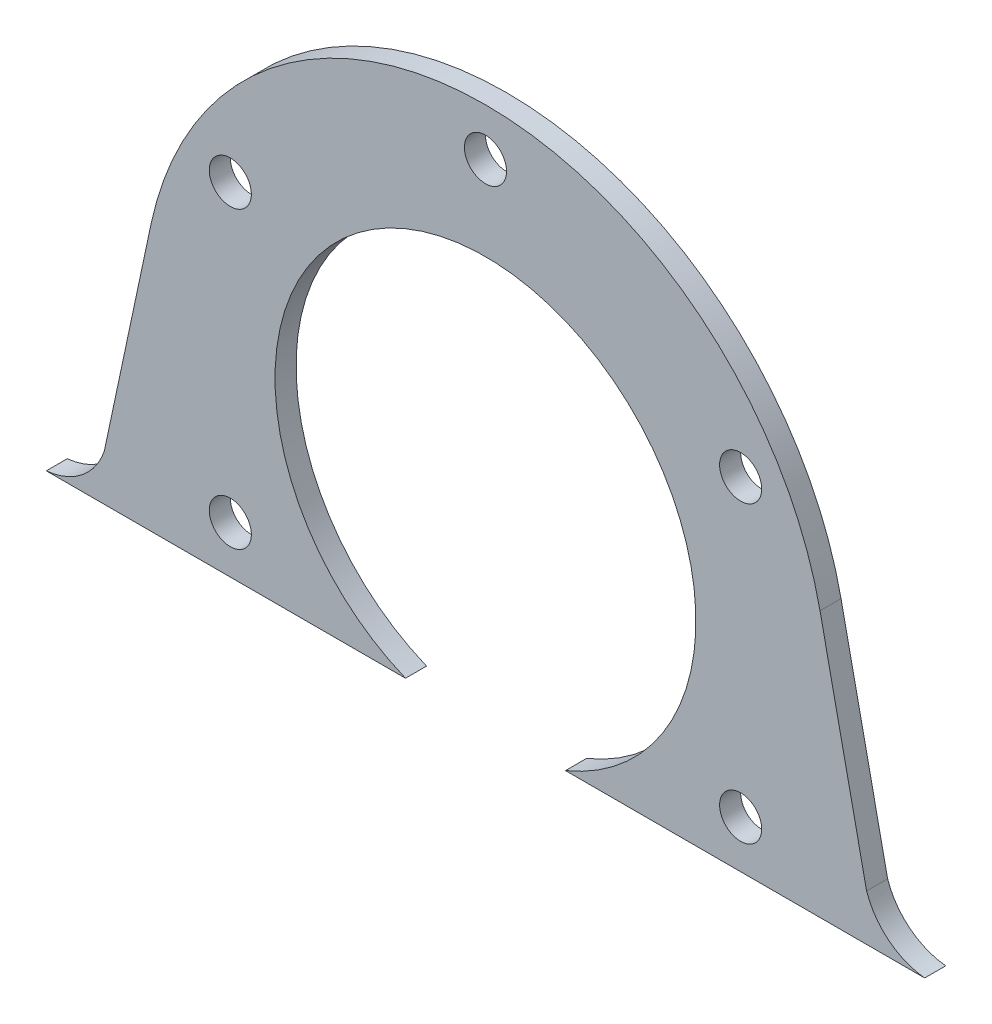
ISO-10303-21;
HEADER;
FILE_DESCRIPTION(('STEP AP214'),'2;1');
FILE_NAME('part.step','',(''),(''),'','','');
FILE_SCHEMA(('AUTOMOTIVE_DESIGN { 1 0 10303 214 1 1 1 1 }'));
ENDSEC;
DATA;
#1=APPLICATION_CONTEXT('core data for automotive mechanical design processes');
#2=APPLICATION_PROTOCOL_DEFINITION('international standard','automotive_design',2000,#1);
#3=PRODUCT_CONTEXT('',#1,'mechanical');
#4=PRODUCT('Part','Part','',(#3));
#5=PRODUCT_RELATED_PRODUCT_CATEGORY('part','',(#4));
#6=PRODUCT_DEFINITION_FORMATION('','',#4);
#7=PRODUCT_DEFINITION_CONTEXT('part definition',#1,'design');
#8=PRODUCT_DEFINITION('design','',#6,#7);
#9=PRODUCT_DEFINITION_SHAPE('','',#8);
#10=(LENGTH_UNIT() NAMED_UNIT(*) SI_UNIT(.MILLI.,.METRE.));
#11=(NAMED_UNIT(*) PLANE_ANGLE_UNIT() SI_UNIT($,.RADIAN.));
#12=(NAMED_UNIT(*) SI_UNIT($,.STERADIAN.) SOLID_ANGLE_UNIT());
#13=UNCERTAINTY_MEASURE_WITH_UNIT(LENGTH_MEASURE(1.E-05),#10,'distance_accuracy_value','');
#14=(GEOMETRIC_REPRESENTATION_CONTEXT(3) GLOBAL_UNCERTAINTY_ASSIGNED_CONTEXT((#13)) GLOBAL_UNIT_ASSIGNED_CONTEXT((#10,
#11,#12)) REPRESENTATION_CONTEXT('',''));
#15=CARTESIAN_POINT('',(0.,0.,0.));
#16=DIRECTION('',(0.,0.,1.));
#17=DIRECTION('',(1.,0.,0.));
#18=AXIS2_PLACEMENT_3D('',#15,#16,#17);
#19=CARTESIAN_POINT('',(50.,-79.,2.));
#20=DIRECTION('',(-0.978189424954487,-0.207714825920562,0.));
#21=DIRECTION('',(0.207714825920562,-0.978189424954488,0.));
#22=AXIS2_PLACEMENT_3D('',#19,#20,#21);
#23=PLANE('',#22);
#24=DIRECTION('',(0.,0.,1.));
#25=VECTOR('',#24,1.);
#26=CARTESIAN_POINT('',(36.2187633729373,-14.1001553613523,0.));
#27=LINE('',#26,#25);
#28=CARTESIAN_POINT('',(36.2187633729373,-14.1001553613523,0.));
#29=VERTEX_POINT('',#28);
#30=CARTESIAN_POINT('',(36.2187633729373,-14.1001553613523,2.));
#31=VERTEX_POINT('',#30);
#32=EDGE_CURVE('E56',#29,#31,#27,.T.);
#33=ORIENTED_EDGE('',*,*,#32,.F.);
#34=DIRECTION('',(-0.207714825920562,0.978189424954487,0.));
#35=VECTOR('',#34,1.);
#36=CARTESIAN_POINT('',(50.,-79.,0.));
#37=LINE('',#36,#35);
#38=CARTESIAN_POINT('',(31.7911563110208,6.75073184241826,0.));
#39=VERTEX_POINT('',#38);
#40=EDGE_CURVE('E121',#29,#39,#37,.T.);
#41=ORIENTED_EDGE('',*,*,#40,.T.);
#42=DIRECTION('',(0.,0.,-1.));
#43=VECTOR('',#42,1.);
#44=CARTESIAN_POINT('',(31.7911563110208,6.75073184241826,2.));
#45=LINE('',#44,#43);
#46=CARTESIAN_POINT('',(31.7911563110208,6.75073184241826,2.));
#47=VERTEX_POINT('',#46);
#48=EDGE_CURVE('E221',#47,#39,#45,.T.);
#49=ORIENTED_EDGE('',*,*,#48,.F.);
#50=DIRECTION('',(-0.207714825920562,0.978189424954487,0.));
#51=VECTOR('',#50,1.);
#52=CARTESIAN_POINT('',(50.,-79.,2.));
#53=LINE('',#52,#51);
#54=EDGE_CURVE('E61',#31,#47,#53,.T.);
#55=ORIENTED_EDGE('',*,*,#54,.F.);
#56=EDGE_LOOP('',(#33,#41,#49,#55));
#57=FACE_BOUND('',#56,.T.);
#58=ADVANCED_FACE('F41',(#57),#23,.F.);
#59=CARTESIAN_POINT('',(0.,0.,2.));
#60=DIRECTION('',(0.,0.,1.));
#61=DIRECTION('',(1.,0.,0.));
#62=AXIS2_PLACEMENT_3D('',#59,#60,#61);
#63=PLANE('',#62);
#64=DIRECTION('',(-1.,0.,0.));
#65=VECTOR('',#64,1.);
#66=CARTESIAN_POINT('',(0.,-18.5,2.));
#67=LINE('',#66,#65);
#68=CARTESIAN_POINT('',(41.73917389931,-18.5,2.));
#69=VERTEX_POINT('',#68);
#70=CARTESIAN_POINT('',(7.59934207678534,-18.5,2.));
#71=VERTEX_POINT('',#70);
#72=EDGE_CURVE('E152',#69,#71,#67,.T.);
#73=ORIENTED_EDGE('',*,*,#72,.F.);
#74=CARTESIAN_POINT('',(42.3650597977949,-12.0516064669532,2.));
#75=DIRECTION('',(0.,0.,1.));
#76=DIRECTION('',(1.,0.,0.));
#77=AXIS2_PLACEMENT_3D('',#74,#75,#76);
#78=CIRCLE('',#77,6.47869680684024);
#79=EDGE_CURVE('E124',#31,#69,#78,.T.);
#80=ORIENTED_EDGE('',*,*,#79,.F.);
#81=ORIENTED_EDGE('',*,*,#54,.T.);
#82=CARTESIAN_POINT('',(0.,0.,2.));
#83=DIRECTION('',(0.,0.,1.));
#84=DIRECTION('',(1.,0.,0.));
#85=AXIS2_PLACEMENT_3D('',#82,#83,#84);
#86=CIRCLE('',#85,32.5);
#87=CARTESIAN_POINT('',(-31.7911563110208,6.75073184241825,2.));
#88=VERTEX_POINT('',#87);
#89=EDGE_CURVE('E202',#47,#88,#86,.T.);
#90=ORIENTED_EDGE('',*,*,#89,.T.);
#91=DIRECTION('',(-0.207714825920562,-0.978189424954487,0.));
#92=VECTOR('',#91,1.);
#93=CARTESIAN_POINT('',(-50.,-79.,2.));
#94=LINE('',#93,#92);
#95=CARTESIAN_POINT('',(-36.2187633729373,-14.1001553613523,2.));
#96=VERTEX_POINT('',#95);
#97=EDGE_CURVE('E206',#88,#96,#94,.T.);
#98=ORIENTED_EDGE('',*,*,#97,.T.);
#99=CARTESIAN_POINT('',(-42.3650597977949,-12.0516064669532,2.));
#100=DIRECTION('',(0.,0.,-1.));
#101=DIRECTION('',(-1.,0.,0.));
#102=AXIS2_PLACEMENT_3D('',#99,#100,#101);
#103=CIRCLE('',#102,6.47869680684024);
#104=CARTESIAN_POINT('',(-41.73917389931,-18.5,2.));
#105=VERTEX_POINT('',#104);
#106=EDGE_CURVE('E132',#96,#105,#103,.T.);
#107=ORIENTED_EDGE('',*,*,#106,.T.);
#108=CARTESIAN_POINT('',(-7.59934207678534,-18.5,2.));
#109=VERTEX_POINT('',#108);
#110=EDGE_CURVE('E149',#109,#105,#67,.T.);
#111=ORIENTED_EDGE('',*,*,#110,.F.);
#112=CARTESIAN_POINT('',(0.,0.,2.));
#113=DIRECTION('',(0.,0.,1.));
#114=DIRECTION('',(1.,0.,0.));
#115=AXIS2_PLACEMENT_3D('',#112,#113,#114);
#116=CIRCLE('',#115,20.);
#117=EDGE_CURVE('E194',#71,#109,#116,.T.);
#118=ORIENTED_EDGE('',*,*,#117,.F.);
#119=EDGE_LOOP('',(#73,#80,#81,#90,#98,#107,#111,#118));
#120=FACE_BOUND('',#119,.T.);
#121=CARTESIAN_POINT('',(-24.2487113059631,-14.0000000000007,2.));
#122=DIRECTION('',(0.,0.,1.));
#123=DIRECTION('',(1.,0.,0.));
#124=AXIS2_PLACEMENT_3D('',#121,#122,#123);
#125=CIRCLE('',#124,2.);
#126=CARTESIAN_POINT('',(-22.2487113059631,-14.0000000000007,2.));
#127=VERTEX_POINT('',#126);
#128=EDGE_CURVE('E162',#127,#127,#125,.T.);
#129=ORIENTED_EDGE('',*,*,#128,.F.);
#130=EDGE_LOOP('',(#129));
#131=FACE_BOUND('',#130,.T.);
#132=CARTESIAN_POINT('',(24.2487113059655,-13.9999999999993,2.));
#133=DIRECTION('',(0.,0.,1.));
#134=DIRECTION('',(1.,0.,0.));
#135=AXIS2_PLACEMENT_3D('',#132,#133,#134);
#136=CIRCLE('',#135,2.);
#137=CARTESIAN_POINT('',(26.2487113059655,-13.9999999999993,2.));
#138=VERTEX_POINT('',#137);
#139=EDGE_CURVE('E170',#138,#138,#136,.T.);
#140=ORIENTED_EDGE('',*,*,#139,.F.);
#141=EDGE_LOOP('',(#140));
#142=FACE_BOUND('',#141,.T.);
#143=CARTESIAN_POINT('',(0.,28.,2.));
#144=DIRECTION('',(0.,0.,1.));
#145=DIRECTION('',(1.,0.,0.));
#146=AXIS2_PLACEMENT_3D('',#143,#144,#145);
#147=CIRCLE('',#146,2.);
#148=CARTESIAN_POINT('',(2.,28.,2.));
#149=VERTEX_POINT('',#148);
#150=EDGE_CURVE('E186',#149,#149,#147,.T.);
#151=ORIENTED_EDGE('',*,*,#150,.F.);
#152=EDGE_LOOP('',(#151));
#153=FACE_BOUND('',#152,.T.);
#154=CARTESIAN_POINT('',(24.2487113059647,14.0000000000007,2.));
#155=DIRECTION('',(0.,0.,1.));
#156=DIRECTION('',(1.,0.,0.));
#157=AXIS2_PLACEMENT_3D('',#154,#155,#156);
#158=CIRCLE('',#157,2.);
#159=CARTESIAN_POINT('',(26.2487113059647,14.0000000000007,2.));
#160=VERTEX_POINT('',#159);
#161=EDGE_CURVE('E178',#160,#160,#158,.T.);
#162=ORIENTED_EDGE('',*,*,#161,.F.);
#163=EDGE_LOOP('',(#162));
#164=FACE_BOUND('',#163,.T.);
#165=CARTESIAN_POINT('',(-24.2487113059639,13.9999999999993,2.));
#166=DIRECTION('',(0.,0.,1.));
#167=DIRECTION('',(1.,0.,0.));
#168=AXIS2_PLACEMENT_3D('',#165,#166,#167);
#169=CIRCLE('',#168,2.);
#170=CARTESIAN_POINT('',(-22.2487113059639,13.9999999999993,2.));
#171=VERTEX_POINT('',#170);
#172=EDGE_CURVE('E153',#171,#171,#169,.T.);
#173=ORIENTED_EDGE('',*,*,#172,.F.);
#174=EDGE_LOOP('',(#173));
#175=FACE_BOUND('',#174,.T.);
#176=ADVANCED_FACE('F233',(#120,#131,#142,#153,#164,#175),#63,.T.);
#177=CARTESIAN_POINT('',(0.,0.,0.));
#178=DIRECTION('',(0.,0.,1.));
#179=DIRECTION('',(1.,0.,0.));
#180=AXIS2_PLACEMENT_3D('',#177,#178,#179);
#181=PLANE('',#180);
#182=ORIENTED_EDGE('',*,*,#40,.F.);
#183=CARTESIAN_POINT('',(42.3650597977949,-12.0516064669532,0.));
#184=DIRECTION('',(0.,0.,1.));
#185=DIRECTION('',(1.,0.,0.));
#186=AXIS2_PLACEMENT_3D('',#183,#184,#185);
#187=CIRCLE('',#186,6.47869680684024);
#188=CARTESIAN_POINT('',(41.73917389931,-18.5,0.));
#189=VERTEX_POINT('',#188);
#190=EDGE_CURVE('E117',#29,#189,#187,.T.);
#191=ORIENTED_EDGE('',*,*,#190,.T.);
#192=DIRECTION('',(1.,0.,0.));
#193=VECTOR('',#192,1.);
#194=CARTESIAN_POINT('',(50.,-18.5,0.));
#195=LINE('',#194,#193);
#196=CARTESIAN_POINT('',(7.59934207678534,-18.5,0.));
#197=VERTEX_POINT('',#196);
#198=EDGE_CURVE('E103',#197,#189,#195,.T.);
#199=ORIENTED_EDGE('',*,*,#198,.F.);
#200=CARTESIAN_POINT('',(0.,0.,0.));
#201=DIRECTION('',(0.,0.,1.));
#202=DIRECTION('',(1.,0.,0.));
#203=AXIS2_PLACEMENT_3D('',#200,#201,#202);
#204=CIRCLE('',#203,20.);
#205=CARTESIAN_POINT('',(-7.59934207678534,-18.5,0.));
#206=VERTEX_POINT('',#205);
#207=EDGE_CURVE('E190',#197,#206,#204,.T.);
#208=ORIENTED_EDGE('',*,*,#207,.T.);
#209=CARTESIAN_POINT('',(-41.73917389931,-18.5,0.));
#210=VERTEX_POINT('',#209);
#211=EDGE_CURVE('E113',#210,#206,#195,.T.);
#212=ORIENTED_EDGE('',*,*,#211,.F.);
#213=CARTESIAN_POINT('',(-42.3650597977949,-12.0516064669532,0.));
#214=DIRECTION('',(0.,0.,-1.));
#215=DIRECTION('',(-1.,0.,0.));
#216=AXIS2_PLACEMENT_3D('',#213,#214,#215);
#217=CIRCLE('',#216,6.47869680684024);
#218=CARTESIAN_POINT('',(-36.2187633729373,-14.1001553613523,0.));
#219=VERTEX_POINT('',#218);
#220=EDGE_CURVE('E136',#219,#210,#217,.T.);
#221=ORIENTED_EDGE('',*,*,#220,.F.);
#222=DIRECTION('',(-0.207714825920562,-0.978189424954487,0.));
#223=VECTOR('',#222,1.);
#224=CARTESIAN_POINT('',(-50.,-79.,0.));
#225=LINE('',#224,#223);
#226=CARTESIAN_POINT('',(-31.7911563110208,6.75073184241825,0.));
#227=VERTEX_POINT('',#226);
#228=EDGE_CURVE('E203',#227,#219,#225,.T.);
#229=ORIENTED_EDGE('',*,*,#228,.F.);
#230=CARTESIAN_POINT('',(0.,0.,0.));
#231=DIRECTION('',(0.,0.,1.));
#232=DIRECTION('',(1.,0.,0.));
#233=AXIS2_PLACEMENT_3D('',#230,#231,#232);
#234=CIRCLE('',#233,32.5);
#235=EDGE_CURVE('E213',#39,#227,#234,.T.);
#236=ORIENTED_EDGE('',*,*,#235,.F.);
#237=EDGE_LOOP('',(#182,#191,#199,#208,#212,#221,#229,#236));
#238=FACE_BOUND('',#237,.T.);
#239=CARTESIAN_POINT('',(0.,28.,0.));
#240=DIRECTION('',(0.,0.,1.));
#241=DIRECTION('',(1.,0.,0.));
#242=AXIS2_PLACEMENT_3D('',#239,#240,#241);
#243=CIRCLE('',#242,2.);
#244=CARTESIAN_POINT('',(2.,28.,0.));
#245=VERTEX_POINT('',#244);
#246=EDGE_CURVE('E182',#245,#245,#243,.T.);
#247=ORIENTED_EDGE('',*,*,#246,.T.);
#248=EDGE_LOOP('',(#247));
#249=FACE_BOUND('',#248,.T.);
#250=CARTESIAN_POINT('',(24.2487113059647,14.0000000000007,0.));
#251=DIRECTION('',(0.,0.,1.));
#252=DIRECTION('',(1.,0.,0.));
#253=AXIS2_PLACEMENT_3D('',#250,#251,#252);
#254=CIRCLE('',#253,2.);
#255=CARTESIAN_POINT('',(26.2487113059647,14.0000000000007,0.));
#256=VERTEX_POINT('',#255);
#257=EDGE_CURVE('E174',#256,#256,#254,.T.);
#258=ORIENTED_EDGE('',*,*,#257,.T.);
#259=EDGE_LOOP('',(#258));
#260=FACE_BOUND('',#259,.T.);
#261=CARTESIAN_POINT('',(24.2487113059655,-13.9999999999993,0.));
#262=DIRECTION('',(0.,0.,1.));
#263=DIRECTION('',(1.,0.,0.));
#264=AXIS2_PLACEMENT_3D('',#261,#262,#263);
#265=CIRCLE('',#264,2.);
#266=CARTESIAN_POINT('',(26.2487113059655,-13.9999999999993,0.));
#267=VERTEX_POINT('',#266);
#268=EDGE_CURVE('E166',#267,#267,#265,.T.);
#269=ORIENTED_EDGE('',*,*,#268,.T.);
#270=EDGE_LOOP('',(#269));
#271=FACE_BOUND('',#270,.T.);
#272=CARTESIAN_POINT('',(-24.2487113059631,-14.0000000000007,0.));
#273=DIRECTION('',(0.,0.,1.));
#274=DIRECTION('',(1.,0.,0.));
#275=AXIS2_PLACEMENT_3D('',#272,#273,#274);
#276=CIRCLE('',#275,2.);
#277=CARTESIAN_POINT('',(-22.2487113059631,-14.0000000000007,0.));
#278=VERTEX_POINT('',#277);
#279=EDGE_CURVE('E157',#278,#278,#276,.T.);
#280=ORIENTED_EDGE('',*,*,#279,.T.);
#281=EDGE_LOOP('',(#280));
#282=FACE_BOUND('',#281,.T.);
#283=CARTESIAN_POINT('',(-24.2487113059639,13.9999999999993,0.));
#284=DIRECTION('',(0.,0.,1.));
#285=DIRECTION('',(1.,0.,0.));
#286=AXIS2_PLACEMENT_3D('',#283,#284,#285);
#287=CIRCLE('',#286,2.);
#288=CARTESIAN_POINT('',(-22.2487113059639,13.9999999999993,0.));
#289=VERTEX_POINT('',#288);
#290=EDGE_CURVE('E158',#289,#289,#287,.T.);
#291=ORIENTED_EDGE('',*,*,#290,.T.);
#292=EDGE_LOOP('',(#291));
#293=FACE_BOUND('',#292,.T.);
#294=ADVANCED_FACE('F118',(#238,#249,#260,#271,#282,#293),#181,.F.);
#295=CARTESIAN_POINT('',(0.,0.,2.));
#296=DIRECTION('',(0.,0.,-1.));
#297=DIRECTION('',(-1.,0.,0.));
#298=AXIS2_PLACEMENT_3D('',#295,#296,#297);
#299=CYLINDRICAL_SURFACE('',#298,32.5);
#300=ORIENTED_EDGE('',*,*,#235,.T.);
#301=DIRECTION('',(0.,0.,-1.));
#302=VECTOR('',#301,1.);
#303=CARTESIAN_POINT('',(-31.7911563110208,6.75073184241825,2.));
#304=LINE('',#303,#302);
#305=EDGE_CURVE('E210',#88,#227,#304,.T.);
#306=ORIENTED_EDGE('',*,*,#305,.F.);
#307=ORIENTED_EDGE('',*,*,#89,.F.);
#308=ORIENTED_EDGE('',*,*,#48,.T.);
#309=EDGE_LOOP('',(#300,#306,#307,#308));
#310=FACE_BOUND('',#309,.T.);
#311=ADVANCED_FACE('F249',(#310),#299,.T.);
#312=CARTESIAN_POINT('',(-50.,-79.,2.));
#313=DIRECTION('',(0.978189424954487,-0.207714825920562,0.));
#314=DIRECTION('',(0.207714825920562,0.978189424954488,0.));
#315=AXIS2_PLACEMENT_3D('',#312,#313,#314);
#316=PLANE('',#315);
#317=ORIENTED_EDGE('',*,*,#228,.T.);
#318=DIRECTION('',(0.,0.,1.));
#319=VECTOR('',#318,1.);
#320=CARTESIAN_POINT('',(-36.2187633729373,-14.1001553613523,0.));
#321=LINE('',#320,#319);
#322=EDGE_CURVE('E140',#219,#96,#321,.T.);
#323=ORIENTED_EDGE('',*,*,#322,.T.);
#324=ORIENTED_EDGE('',*,*,#97,.F.);
#325=ORIENTED_EDGE('',*,*,#305,.T.);
#326=EDGE_LOOP('',(#317,#323,#324,#325));
#327=FACE_BOUND('',#326,.T.);
#328=ADVANCED_FACE('F245',(#327),#316,.F.);
#329=CARTESIAN_POINT('',(0.,0.,2.));
#330=DIRECTION('',(0.,0.,-1.));
#331=DIRECTION('',(-1.,0.,0.));
#332=AXIS2_PLACEMENT_3D('',#329,#330,#331);
#333=CYLINDRICAL_SURFACE('',#332,20.);
#334=DIRECTION('',(0.,0.,-1.));
#335=VECTOR('',#334,1.);
#336=CARTESIAN_POINT('',(7.59934207678534,-18.5,2.));
#337=LINE('',#336,#335);
#338=EDGE_CURVE('E11',#71,#197,#337,.T.);
#339=ORIENTED_EDGE('',*,*,#338,.F.);
#340=ORIENTED_EDGE('',*,*,#117,.T.);
#341=DIRECTION('',(0.,0.,-1.));
#342=VECTOR('',#341,1.);
#343=CARTESIAN_POINT('',(-7.59934207678534,-18.5,2.));
#344=LINE('',#343,#342);
#345=EDGE_CURVE('E49',#206,#109,#344,.F.);
#346=ORIENTED_EDGE('',*,*,#345,.F.);
#347=ORIENTED_EDGE('',*,*,#207,.F.);
#348=EDGE_LOOP('',(#339,#340,#346,#347));
#349=FACE_BOUND('',#348,.T.);
#350=ADVANCED_FACE('F236',(#349),#333,.F.);
#351=CARTESIAN_POINT('',(0.,28.,2.));
#352=DIRECTION('',(0.,0.,-1.));
#353=DIRECTION('',(-1.,0.,0.));
#354=AXIS2_PLACEMENT_3D('',#351,#352,#353);
#355=CYLINDRICAL_SURFACE('',#354,2.);
#356=ORIENTED_EDGE('',*,*,#150,.T.);
#357=EDGE_LOOP('',(#356));
#358=FACE_BOUND('',#357,.T.);
#359=ORIENTED_EDGE('',*,*,#246,.F.);
#360=EDGE_LOOP('',(#359));
#361=FACE_BOUND('',#360,.T.);
#362=ADVANCED_FACE('F286',(#358,#361),#355,.F.);
#363=CARTESIAN_POINT('',(24.2487113059647,14.0000000000007,2.));
#364=DIRECTION('',(0.,0.,-1.));
#365=DIRECTION('',(-1.,0.,0.));
#366=AXIS2_PLACEMENT_3D('',#363,#364,#365);
#367=CYLINDRICAL_SURFACE('',#366,2.);
#368=ORIENTED_EDGE('',*,*,#161,.T.);
#369=EDGE_LOOP('',(#368));
#370=FACE_BOUND('',#369,.T.);
#371=ORIENTED_EDGE('',*,*,#257,.F.);
#372=EDGE_LOOP('',(#371));
#373=FACE_BOUND('',#372,.T.);
#374=ADVANCED_FACE('F295',(#370,#373),#367,.F.);
#375=CARTESIAN_POINT('',(24.2487113059655,-13.9999999999993,2.));
#376=DIRECTION('',(0.,0.,-1.));
#377=DIRECTION('',(-1.,0.,0.));
#378=AXIS2_PLACEMENT_3D('',#375,#376,#377);
#379=CYLINDRICAL_SURFACE('',#378,2.);
#380=ORIENTED_EDGE('',*,*,#139,.T.);
#381=EDGE_LOOP('',(#380));
#382=FACE_BOUND('',#381,.T.);
#383=ORIENTED_EDGE('',*,*,#268,.F.);
#384=EDGE_LOOP('',(#383));
#385=FACE_BOUND('',#384,.T.);
#386=ADVANCED_FACE('F303',(#382,#385),#379,.F.);
#387=CARTESIAN_POINT('',(-24.2487113059631,-14.0000000000007,2.));
#388=DIRECTION('',(0.,0.,-1.));
#389=DIRECTION('',(-1.,0.,0.));
#390=AXIS2_PLACEMENT_3D('',#387,#388,#389);
#391=CYLINDRICAL_SURFACE('',#390,2.);
#392=ORIENTED_EDGE('',*,*,#128,.T.);
#393=EDGE_LOOP('',(#392));
#394=FACE_BOUND('',#393,.T.);
#395=ORIENTED_EDGE('',*,*,#279,.F.);
#396=EDGE_LOOP('',(#395));
#397=FACE_BOUND('',#396,.T.);
#398=ADVANCED_FACE('F313',(#394,#397),#391,.F.);
#399=CARTESIAN_POINT('',(-24.2487113059639,13.9999999999993,2.));
#400=DIRECTION('',(0.,0.,-1.));
#401=DIRECTION('',(-1.,0.,0.));
#402=AXIS2_PLACEMENT_3D('',#399,#400,#401);
#403=CYLINDRICAL_SURFACE('',#402,2.);
#404=ORIENTED_EDGE('',*,*,#172,.T.);
#405=EDGE_LOOP('',(#404));
#406=FACE_BOUND('',#405,.T.);
#407=ORIENTED_EDGE('',*,*,#290,.F.);
#408=EDGE_LOOP('',(#407));
#409=FACE_BOUND('',#408,.T.);
#410=ADVANCED_FACE('F320',(#406,#409),#403,.F.);
#411=CARTESIAN_POINT('',(50.,-18.5,10.));
#412=DIRECTION('',(0.,1.,0.));
#413=DIRECTION('',(0.,0.,1.));
#414=AXIS2_PLACEMENT_3D('',#411,#412,#413);
#415=PLANE('',#414);
#416=ORIENTED_EDGE('',*,*,#211,.T.);
#417=ORIENTED_EDGE('',*,*,#345,.T.);
#418=ORIENTED_EDGE('',*,*,#110,.T.);
#419=DIRECTION('',(0.,0.,1.));
#420=VECTOR('',#419,1.);
#421=CARTESIAN_POINT('',(-41.73917389931,-18.5,0.));
#422=LINE('',#421,#420);
#423=EDGE_CURVE('E114',#210,#105,#422,.T.);
#424=ORIENTED_EDGE('',*,*,#423,.F.);
#425=EDGE_LOOP('',(#416,#417,#418,#424));
#426=FACE_BOUND('',#425,.T.);
#427=ADVANCED_FACE('F228',(#426),#415,.F.);
#428=ORIENTED_EDGE('',*,*,#72,.T.);
#429=ORIENTED_EDGE('',*,*,#338,.T.);
#430=ORIENTED_EDGE('',*,*,#198,.T.);
#431=DIRECTION('',(0.,0.,1.));
#432=VECTOR('',#431,1.);
#433=CARTESIAN_POINT('',(41.73917389931,-18.5,0.));
#434=LINE('',#433,#432);
#435=EDGE_CURVE('E107',#189,#69,#434,.T.);
#436=ORIENTED_EDGE('',*,*,#435,.T.);
#437=EDGE_LOOP('',(#428,#429,#430,#436));
#438=FACE_BOUND('',#437,.T.);
#439=ADVANCED_FACE('F105',(#438),#415,.F.);
#440=CARTESIAN_POINT('',(-42.3650597977949,-12.0516064669532,0.));
#441=DIRECTION('',(0.,0.,1.));
#442=DIRECTION('',(1.,0.,0.));
#443=AXIS2_PLACEMENT_3D('',#440,#441,#442);
#444=CYLINDRICAL_SURFACE('',#443,6.47869680684024);
#445=ORIENTED_EDGE('',*,*,#106,.F.);
#446=ORIENTED_EDGE('',*,*,#322,.F.);
#447=ORIENTED_EDGE('',*,*,#220,.T.);
#448=ORIENTED_EDGE('',*,*,#423,.T.);
#449=EDGE_LOOP('',(#445,#446,#447,#448));
#450=FACE_BOUND('',#449,.T.);
#451=ADVANCED_FACE('F242',(#450),#444,.F.);
#452=CARTESIAN_POINT('',(42.3650597977949,-12.0516064669532,0.));
#453=DIRECTION('',(0.,0.,1.));
#454=DIRECTION('',(1.,0.,0.));
#455=AXIS2_PLACEMENT_3D('',#452,#453,#454);
#456=CYLINDRICAL_SURFACE('',#455,6.47869680684024);
#457=ORIENTED_EDGE('',*,*,#79,.T.);
#458=ORIENTED_EDGE('',*,*,#435,.F.);
#459=ORIENTED_EDGE('',*,*,#190,.F.);
#460=ORIENTED_EDGE('',*,*,#32,.T.);
#461=EDGE_LOOP('',(#457,#458,#459,#460));
#462=FACE_BOUND('',#461,.T.);
#463=ADVANCED_FACE('F127',(#462),#456,.F.);
#464=CLOSED_SHELL('',(#58,#176,#294,#311,#328,#350,#362,#374,#386,#398,#410,#427,#439,#451,#463));
#465=MANIFOLD_SOLID_BREP('B2',#464);
#466=ADVANCED_BREP_SHAPE_REPRESENTATION('',(#18,#465),#14);
#467=SHAPE_DEFINITION_REPRESENTATION(#9,#466);
ENDSEC;
END-ISO-10303-21;
